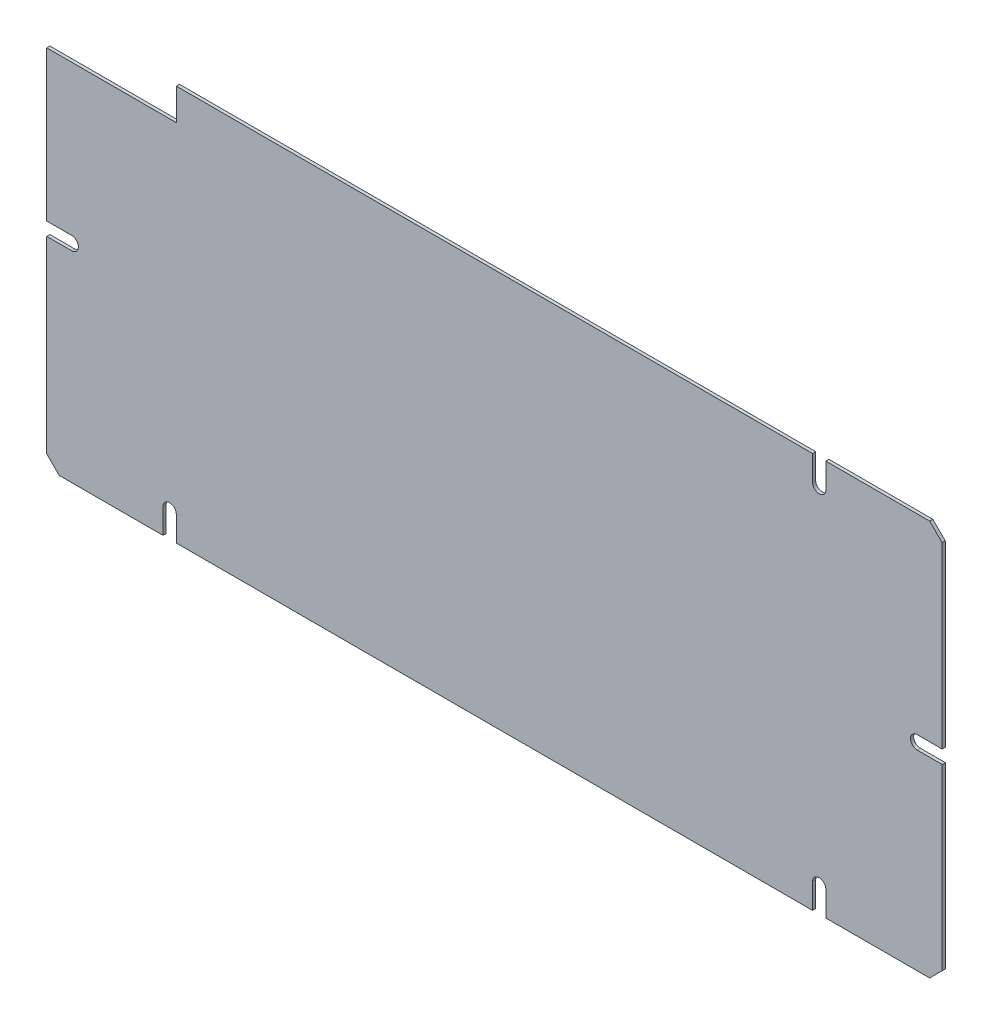
ISO-10303-21;
HEADER;
FILE_DESCRIPTION(('STEP AP214'),'2;1');
FILE_NAME('part.step','',(''),(''),'','','');
FILE_SCHEMA(('AUTOMOTIVE_DESIGN { 1 0 10303 214 1 1 1 1 }'));
ENDSEC;
DATA;
#1=APPLICATION_CONTEXT('core data for automotive mechanical design processes');
#2=APPLICATION_PROTOCOL_DEFINITION('international standard','automotive_design',2000,#1);
#3=PRODUCT_CONTEXT('',#1,'mechanical');
#4=PRODUCT('Part','Part','',(#3));
#5=PRODUCT_RELATED_PRODUCT_CATEGORY('part','',(#4));
#6=PRODUCT_DEFINITION_FORMATION('','',#4);
#7=PRODUCT_DEFINITION_CONTEXT('part definition',#1,'design');
#8=PRODUCT_DEFINITION('design','',#6,#7);
#9=PRODUCT_DEFINITION_SHAPE('','',#8);
#10=(LENGTH_UNIT() NAMED_UNIT(*) SI_UNIT(.MILLI.,.METRE.));
#11=(NAMED_UNIT(*) PLANE_ANGLE_UNIT() SI_UNIT($,.RADIAN.));
#12=(NAMED_UNIT(*) SI_UNIT($,.STERADIAN.) SOLID_ANGLE_UNIT());
#13=UNCERTAINTY_MEASURE_WITH_UNIT(LENGTH_MEASURE(1.E-05),#10,'distance_accuracy_value','');
#14=(GEOMETRIC_REPRESENTATION_CONTEXT(3) GLOBAL_UNCERTAINTY_ASSIGNED_CONTEXT((#13)) GLOBAL_UNIT_ASSIGNED_CONTEXT((#10,
#11,#12)) REPRESENTATION_CONTEXT('',''));
#15=CARTESIAN_POINT('',(0.,0.,0.));
#16=DIRECTION('',(0.,0.,1.));
#17=DIRECTION('',(1.,0.,0.));
#18=AXIS2_PLACEMENT_3D('',#15,#16,#17);
#19=CARTESIAN_POINT('',(227.584,100.584,1.5875));
#20=DIRECTION('',(-1.,0.,0.));
#21=DIRECTION('',(0.,0.,1.));
#22=AXIS2_PLACEMENT_3D('',#19,#20,#21);
#23=PLANE('',#22);
#24=DIRECTION('',(0.,1.,0.));
#25=VECTOR('',#24,1.);
#26=CARTESIAN_POINT('',(227.584,100.584,0.));
#27=LINE('',#26,#25);
#28=CARTESIAN_POINT('',(227.584,3.37819999999997,0.));
#29=VERTEX_POINT('',#28);
#30=CARTESIAN_POINT('',(227.584,94.2340000000001,0.));
#31=VERTEX_POINT('',#30);
#32=EDGE_CURVE('E389',#29,#31,#27,.T.);
#33=ORIENTED_EDGE('',*,*,#32,.T.);
#34=DIRECTION('',(0.,0.,1.));
#35=VECTOR('',#34,1.);
#36=CARTESIAN_POINT('',(227.584,94.2340000000001,1.5875));
#37=LINE('',#36,#35);
#38=CARTESIAN_POINT('',(227.584,94.2340000000001,1.5875));
#39=VERTEX_POINT('',#38);
#40=EDGE_CURVE('E11',#31,#39,#37,.T.);
#41=ORIENTED_EDGE('',*,*,#40,.T.);
#42=DIRECTION('',(0.,1.,0.));
#43=VECTOR('',#42,1.);
#44=CARTESIAN_POINT('',(227.584,100.584,1.5875));
#45=LINE('',#44,#43);
#46=CARTESIAN_POINT('',(227.584,3.37819999999997,1.5875));
#47=VERTEX_POINT('',#46);
#48=EDGE_CURVE('E392',#47,#39,#45,.T.);
#49=ORIENTED_EDGE('',*,*,#48,.F.);
#50=DIRECTION('',(0.,0.,1.));
#51=VECTOR('',#50,1.);
#52=CARTESIAN_POINT('',(227.584,3.37819999999997,-0.000999999999999916));
#53=LINE('',#52,#51);
#54=EDGE_CURVE('E258',#29,#47,#53,.T.);
#55=ORIENTED_EDGE('',*,*,#54,.F.);
#56=EDGE_LOOP('',(#33,#41,#49,#55));
#57=FACE_BOUND('',#56,.T.);
#58=ADVANCED_FACE('F34',(#57),#23,.F.);
#59=CARTESIAN_POINT('',(-227.584,100.584,1.5875));
#60=DIRECTION('',(1.,0.,0.));
#61=DIRECTION('',(0.,0.,-1.));
#62=AXIS2_PLACEMENT_3D('',#59,#60,#61);
#63=PLANE('',#62);
#64=DIRECTION('',(0.,-1.,0.));
#65=VECTOR('',#64,1.);
#66=CARTESIAN_POINT('',(-227.584,100.584,0.));
#67=LINE('',#66,#65);
#68=CARTESIAN_POINT('',(-227.584,1.50579999999863,0.));
#69=VERTEX_POINT('',#68);
#70=CARTESIAN_POINT('',(-227.584,-94.234,0.));
#71=VERTEX_POINT('',#70);
#72=EDGE_CURVE('E408',#69,#71,#67,.T.);
#73=ORIENTED_EDGE('',*,*,#72,.T.);
#74=DIRECTION('',(0.,0.,1.));
#75=VECTOR('',#74,1.);
#76=CARTESIAN_POINT('',(-227.584,-94.234,1.5875));
#77=LINE('',#76,#75);
#78=CARTESIAN_POINT('',(-227.584,-94.234,1.5875));
#79=VERTEX_POINT('',#78);
#80=EDGE_CURVE('E423',#71,#79,#77,.T.);
#81=ORIENTED_EDGE('',*,*,#80,.T.);
#82=DIRECTION('',(0.,-1.,0.));
#83=VECTOR('',#82,1.);
#84=CARTESIAN_POINT('',(-227.584,100.584,1.5875));
#85=LINE('',#84,#83);
#86=CARTESIAN_POINT('',(-227.584,1.50579999999863,1.5875));
#87=VERTEX_POINT('',#86);
#88=EDGE_CURVE('E395',#87,#79,#85,.T.);
#89=ORIENTED_EDGE('',*,*,#88,.F.);
#90=DIRECTION('',(0.,0.,1.));
#91=VECTOR('',#90,1.);
#92=CARTESIAN_POINT('',(-227.584,1.50579999999863,-0.000999999999999916));
#93=LINE('',#92,#91);
#94=EDGE_CURVE('E269',#69,#87,#93,.T.);
#95=ORIENTED_EDGE('',*,*,#94,.F.);
#96=EDGE_LOOP('',(#73,#81,#89,#95));
#97=FACE_BOUND('',#96,.T.);
#98=ADVANCED_FACE('F484',(#97),#63,.F.);
#99=CARTESIAN_POINT('',(-214.884,4.88399999999863,1.5875));
#100=DIRECTION('',(0.,0.,1.));
#101=DIRECTION('',(1.,0.,0.));
#102=AXIS2_PLACEMENT_3D('',#99,#100,#101);
#103=CYLINDRICAL_SURFACE('',#102,3.3782);
#104=DIRECTION('',(0.,0.,1.));
#105=VECTOR('',#104,1.);
#106=CARTESIAN_POINT('',(-214.884,1.50579999999863,1.5875));
#107=LINE('',#106,#105);
#108=CARTESIAN_POINT('',(-214.884,1.50579999999863,0.));
#109=VERTEX_POINT('',#108);
#110=CARTESIAN_POINT('',(-214.884,1.50579999999863,1.5875));
#111=VERTEX_POINT('',#110);
#112=EDGE_CURVE('E257',#109,#111,#107,.T.);
#113=ORIENTED_EDGE('',*,*,#112,.T.);
#114=CARTESIAN_POINT('',(-214.884,4.88399999999863,1.5875));
#115=DIRECTION('',(0.,0.,1.));
#116=DIRECTION('',(1.,0.,0.));
#117=AXIS2_PLACEMENT_3D('',#114,#115,#116);
#118=CIRCLE('',#117,3.3782);
#119=CARTESIAN_POINT('',(-214.884,8.26219999999862,1.5875));
#120=VERTEX_POINT('',#119);
#121=EDGE_CURVE('E383',#111,#120,#118,.T.);
#122=ORIENTED_EDGE('',*,*,#121,.T.);
#123=DIRECTION('',(0.,0.,1.));
#124=VECTOR('',#123,1.);
#125=CARTESIAN_POINT('',(-214.884,8.26219999999862,1.5875));
#126=LINE('',#125,#124);
#127=CARTESIAN_POINT('',(-214.884,8.26219999999862,0.));
#128=VERTEX_POINT('',#127);
#129=EDGE_CURVE('E255',#128,#120,#126,.T.);
#130=ORIENTED_EDGE('',*,*,#129,.F.);
#131=CARTESIAN_POINT('',(-214.884,4.88399999999863,0.));
#132=DIRECTION('',(0.,0.,1.));
#133=DIRECTION('',(1.,0.,0.));
#134=AXIS2_PLACEMENT_3D('',#131,#132,#133);
#135=CIRCLE('',#134,3.3782);
#136=EDGE_CURVE('E386',#109,#128,#135,.T.);
#137=ORIENTED_EDGE('',*,*,#136,.F.);
#138=EDGE_LOOP('',(#113,#122,#130,#137));
#139=FACE_BOUND('',#138,.T.);
#140=ADVANCED_FACE('F474',(#139),#103,.F.);
#141=CARTESIAN_POINT('',(214.884,0.,1.5875));
#142=DIRECTION('',(0.,0.,1.));
#143=DIRECTION('',(1.,0.,0.));
#144=AXIS2_PLACEMENT_3D('',#141,#142,#143);
#145=CYLINDRICAL_SURFACE('',#144,3.3782);
#146=DIRECTION('',(0.,0.,1.));
#147=VECTOR('',#146,1.);
#148=CARTESIAN_POINT('',(214.884,3.37820000000003,1.5875));
#149=LINE('',#148,#147);
#150=CARTESIAN_POINT('',(214.884,3.37820000000003,1.5875));
#151=VERTEX_POINT('',#150);
#152=CARTESIAN_POINT('',(214.884,3.37820000000003,0.));
#153=VERTEX_POINT('',#152);
#154=EDGE_CURVE('E253',#151,#153,#149,.F.);
#155=ORIENTED_EDGE('',*,*,#154,.F.);
#156=CARTESIAN_POINT('',(214.884,0.,1.5875));
#157=DIRECTION('',(0.,0.,1.));
#158=DIRECTION('',(1.,0.,0.));
#159=AXIS2_PLACEMENT_3D('',#156,#157,#158);
#160=CIRCLE('',#159,3.3782);
#161=CARTESIAN_POINT('',(214.884,-3.37819999999997,1.5875));
#162=VERTEX_POINT('',#161);
#163=EDGE_CURVE('E365',#151,#162,#160,.T.);
#164=ORIENTED_EDGE('',*,*,#163,.T.);
#165=DIRECTION('',(0.,0.,1.));
#166=VECTOR('',#165,1.);
#167=CARTESIAN_POINT('',(214.884,-3.37819999999997,1.5875));
#168=LINE('',#167,#166);
#169=CARTESIAN_POINT('',(214.884,-3.37819999999997,0.));
#170=VERTEX_POINT('',#169);
#171=EDGE_CURVE('E277',#170,#162,#168,.T.);
#172=ORIENTED_EDGE('',*,*,#171,.F.);
#173=CARTESIAN_POINT('',(214.884,0.,0.));
#174=DIRECTION('',(0.,0.,1.));
#175=DIRECTION('',(1.,0.,0.));
#176=AXIS2_PLACEMENT_3D('',#173,#174,#175);
#177=CIRCLE('',#176,3.3782);
#178=EDGE_CURVE('E368',#153,#170,#177,.T.);
#179=ORIENTED_EDGE('',*,*,#178,.F.);
#180=EDGE_LOOP('',(#155,#164,#172,#179));
#181=FACE_BOUND('',#180,.T.);
#182=ADVANCED_FACE('F533',(#181),#145,.F.);
#183=CARTESIAN_POINT('',(-227.584,-100.584,1.5875));
#184=DIRECTION('',(0.,1.,0.));
#185=DIRECTION('',(0.,0.,1.));
#186=AXIS2_PLACEMENT_3D('',#183,#184,#185);
#187=PLANE('',#186);
#188=DIRECTION('',(1.,0.,0.));
#189=VECTOR('',#188,1.);
#190=CARTESIAN_POINT('',(-227.584,-100.584,1.5875));
#191=LINE('',#190,#189);
#192=CARTESIAN_POINT('',(-221.234,-100.584,1.5875));
#193=VERTEX_POINT('',#192);
#194=CARTESIAN_POINT('',(-168.4782,-100.584,1.5875));
#195=VERTEX_POINT('',#194);
#196=EDGE_CURVE('E399',#193,#195,#191,.T.);
#197=ORIENTED_EDGE('',*,*,#196,.F.);
#198=DIRECTION('',(0.,0.,-1.));
#199=VECTOR('',#198,1.);
#200=CARTESIAN_POINT('',(-221.234,-100.584,1.5875));
#201=LINE('',#200,#199);
#202=CARTESIAN_POINT('',(-221.234,-100.584,0.));
#203=VERTEX_POINT('',#202);
#204=EDGE_CURVE('E401',#193,#203,#201,.T.);
#205=ORIENTED_EDGE('',*,*,#204,.T.);
#206=DIRECTION('',(1.,0.,0.));
#207=VECTOR('',#206,1.);
#208=CARTESIAN_POINT('',(-227.584,-100.584,0.));
#209=LINE('',#208,#207);
#210=CARTESIAN_POINT('',(-168.4782,-100.584,0.));
#211=VERTEX_POINT('',#210);
#212=EDGE_CURVE('E412',#203,#211,#209,.T.);
#213=ORIENTED_EDGE('',*,*,#212,.T.);
#214=DIRECTION('',(0.,0.,1.));
#215=VECTOR('',#214,1.);
#216=CARTESIAN_POINT('',(-168.4782,-100.584,-0.000999999999999916));
#217=LINE('',#216,#215);
#218=EDGE_CURVE('E302',#211,#195,#217,.T.);
#219=ORIENTED_EDGE('',*,*,#218,.T.);
#220=EDGE_LOOP('',(#197,#205,#213,#219));
#221=FACE_BOUND('',#220,.T.);
#222=ADVANCED_FACE('F492',(#221),#187,.F.);
#223=DIRECTION('',(0.,0.,-1.));
#224=VECTOR('',#223,1.);
#225=CARTESIAN_POINT('',(-161.7218,-100.584,-0.000999999999999916));
#226=LINE('',#225,#224);
#227=CARTESIAN_POINT('',(-161.7218,-100.584,1.5875));
#228=VERTEX_POINT('',#227);
#229=CARTESIAN_POINT('',(-161.7218,-100.584,0.));
#230=VERTEX_POINT('',#229);
#231=EDGE_CURVE('E299',#228,#230,#226,.T.);
#232=ORIENTED_EDGE('',*,*,#231,.T.);
#233=CARTESIAN_POINT('',(161.7218,-100.584,0.));
#234=VERTEX_POINT('',#233);
#235=EDGE_CURVE('E414',#230,#234,#209,.T.);
#236=ORIENTED_EDGE('',*,*,#235,.T.);
#237=DIRECTION('',(0.,0.,1.));
#238=VECTOR('',#237,1.);
#239=CARTESIAN_POINT('',(161.7218,-100.584,-0.000999999999999916));
#240=LINE('',#239,#238);
#241=CARTESIAN_POINT('',(161.7218,-100.584,1.5875));
#242=VERTEX_POINT('',#241);
#243=EDGE_CURVE('E326',#234,#242,#240,.T.);
#244=ORIENTED_EDGE('',*,*,#243,.T.);
#245=EDGE_CURVE('E402',#228,#242,#191,.T.);
#246=ORIENTED_EDGE('',*,*,#245,.F.);
#247=EDGE_LOOP('',(#232,#236,#244,#246));
#248=FACE_BOUND('',#247,.T.);
#249=ADVANCED_FACE('F505',(#248),#187,.F.);
#250=CARTESIAN_POINT('',(168.4782,-100.584,0.));
#251=VERTEX_POINT('',#250);
#252=CARTESIAN_POINT('',(221.234,-100.584,0.));
#253=VERTEX_POINT('',#252);
#254=EDGE_CURVE('E411',#251,#253,#209,.T.);
#255=ORIENTED_EDGE('',*,*,#254,.T.);
#256=DIRECTION('',(0.,0.,1.));
#257=VECTOR('',#256,1.);
#258=CARTESIAN_POINT('',(221.234,-100.584,1.5875));
#259=LINE('',#258,#257);
#260=CARTESIAN_POINT('',(221.234,-100.584,1.5875));
#261=VERTEX_POINT('',#260);
#262=EDGE_CURVE('E433',#253,#261,#259,.T.);
#263=ORIENTED_EDGE('',*,*,#262,.T.);
#264=CARTESIAN_POINT('',(168.4782,-100.584,1.5875));
#265=VERTEX_POINT('',#264);
#266=EDGE_CURVE('E398',#265,#261,#191,.T.);
#267=ORIENTED_EDGE('',*,*,#266,.F.);
#268=DIRECTION('',(0.,0.,-1.));
#269=VECTOR('',#268,1.);
#270=CARTESIAN_POINT('',(168.4782,-100.584,-0.000999999999999916));
#271=LINE('',#270,#269);
#272=EDGE_CURVE('E323',#265,#251,#271,.T.);
#273=ORIENTED_EDGE('',*,*,#272,.T.);
#274=EDGE_LOOP('',(#255,#263,#267,#273));
#275=FACE_BOUND('',#274,.T.);
#276=ADVANCED_FACE('F582',(#275),#187,.F.);
#277=CARTESIAN_POINT('',(0.,0.,1.5875));
#278=DIRECTION('',(0.,0.,1.));
#279=DIRECTION('',(1.,0.,0.));
#280=AXIS2_PLACEMENT_3D('',#277,#278,#279);
#281=PLANE('',#280);
#282=ORIENTED_EDGE('',*,*,#88,.T.);
#283=DIRECTION('',(-0.707106781186548,0.707106781186548,0.));
#284=VECTOR('',#283,1.);
#285=CARTESIAN_POINT('',(-160.909,-160.909,1.5875));
#286=LINE('',#285,#284);
#287=EDGE_CURVE('E428',#79,#193,#286,.F.);
#288=ORIENTED_EDGE('',*,*,#287,.T.);
#289=ORIENTED_EDGE('',*,*,#196,.T.);
#290=DIRECTION('',(0.,1.,0.));
#291=VECTOR('',#290,1.);
#292=CARTESIAN_POINT('',(-168.4782,-87.884,1.5875));
#293=LINE('',#292,#291);
#294=CARTESIAN_POINT('',(-168.4782,-87.884,1.5875));
#295=VERTEX_POINT('',#294);
#296=EDGE_CURVE('E308',#195,#295,#293,.T.);
#297=ORIENTED_EDGE('',*,*,#296,.T.);
#298=CARTESIAN_POINT('',(-165.1,-87.884,1.5875));
#299=DIRECTION('',(0.,0.,1.));
#300=DIRECTION('',(1.,0.,0.));
#301=AXIS2_PLACEMENT_3D('',#298,#299,#300);
#302=CIRCLE('',#301,3.3782);
#303=CARTESIAN_POINT('',(-161.7218,-87.884,1.5875));
#304=VERTEX_POINT('',#303);
#305=EDGE_CURVE('E371',#304,#295,#302,.T.);
#306=ORIENTED_EDGE('',*,*,#305,.F.);
#307=DIRECTION('',(0.,-1.,0.));
#308=VECTOR('',#307,1.);
#309=CARTESIAN_POINT('',(-161.7218,-87.884,1.5875));
#310=LINE('',#309,#308);
#311=EDGE_CURVE('E311',#304,#228,#310,.T.);
#312=ORIENTED_EDGE('',*,*,#311,.T.);
#313=ORIENTED_EDGE('',*,*,#245,.T.);
#314=DIRECTION('',(0.,1.,0.));
#315=VECTOR('',#314,1.);
#316=CARTESIAN_POINT('',(161.7218,-87.884,1.5875));
#317=LINE('',#316,#315);
#318=CARTESIAN_POINT('',(161.7218,-87.884,1.5875));
#319=VERTEX_POINT('',#318);
#320=EDGE_CURVE('E332',#242,#319,#317,.T.);
#321=ORIENTED_EDGE('',*,*,#320,.T.);
#322=CARTESIAN_POINT('',(165.1,-87.884,1.5875));
#323=DIRECTION('',(0.,0.,1.));
#324=DIRECTION('',(1.,0.,0.));
#325=AXIS2_PLACEMENT_3D('',#322,#323,#324);
#326=CIRCLE('',#325,3.3782);
#327=CARTESIAN_POINT('',(168.4782,-87.884,1.5875));
#328=VERTEX_POINT('',#327);
#329=EDGE_CURVE('E377',#328,#319,#326,.T.);
#330=ORIENTED_EDGE('',*,*,#329,.F.);
#331=DIRECTION('',(0.,-1.,0.));
#332=VECTOR('',#331,1.);
#333=CARTESIAN_POINT('',(168.4782,-87.884,1.5875));
#334=LINE('',#333,#332);
#335=EDGE_CURVE('E335',#328,#265,#334,.T.);
#336=ORIENTED_EDGE('',*,*,#335,.T.);
#337=ORIENTED_EDGE('',*,*,#266,.T.);
#338=DIRECTION('',(-0.707106781186548,-0.707106781186548,0.));
#339=VECTOR('',#338,1.);
#340=CARTESIAN_POINT('',(160.909,-160.909,1.5875));
#341=LINE('',#340,#339);
#342=CARTESIAN_POINT('',(227.584,-94.2340000000001,1.5875));
#343=VERTEX_POINT('',#342);
#344=EDGE_CURVE('E426',#261,#343,#341,.F.);
#345=ORIENTED_EDGE('',*,*,#344,.T.);
#346=CARTESIAN_POINT('',(227.584,-3.37819999999997,1.5875));
#347=VERTEX_POINT('',#346);
#348=EDGE_CURVE('E390',#343,#347,#45,.T.);
#349=ORIENTED_EDGE('',*,*,#348,.T.);
#350=DIRECTION('',(1.,0.,0.));
#351=VECTOR('',#350,1.);
#352=CARTESIAN_POINT('',(214.884,-3.37819999999997,1.5875));
#353=LINE('',#352,#351);
#354=EDGE_CURVE('E285',#162,#347,#353,.T.);
#355=ORIENTED_EDGE('',*,*,#354,.F.);
#356=ORIENTED_EDGE('',*,*,#163,.F.);
#357=DIRECTION('',(-1.,0.,0.));
#358=VECTOR('',#357,1.);
#359=CARTESIAN_POINT('',(227.584,3.37819999999997,1.5875));
#360=LINE('',#359,#358);
#361=EDGE_CURVE('E283',#47,#151,#360,.T.);
#362=ORIENTED_EDGE('',*,*,#361,.F.);
#363=ORIENTED_EDGE('',*,*,#48,.T.);
#364=DIRECTION('',(0.707106781186548,-0.707106781186548,0.));
#365=VECTOR('',#364,1.);
#366=CARTESIAN_POINT('',(160.909,160.909,1.5875));
#367=LINE('',#366,#365);
#368=CARTESIAN_POINT('',(221.234,100.584,1.5875));
#369=VERTEX_POINT('',#368);
#370=EDGE_CURVE('E49',#39,#369,#367,.F.);
#371=ORIENTED_EDGE('',*,*,#370,.T.);
#372=DIRECTION('',(-1.,0.,0.));
#373=VECTOR('',#372,1.);
#374=CARTESIAN_POINT('',(-227.584,100.584,1.5875));
#375=LINE('',#374,#373);
#376=CARTESIAN_POINT('',(168.4782,100.584,1.5875));
#377=VERTEX_POINT('',#376);
#378=EDGE_CURVE('E393',#369,#377,#375,.T.);
#379=ORIENTED_EDGE('',*,*,#378,.T.);
#380=DIRECTION('',(0.,1.,0.));
#381=VECTOR('',#380,1.);
#382=CARTESIAN_POINT('',(168.4782,87.884,1.5875));
#383=LINE('',#382,#381);
#384=CARTESIAN_POINT('',(168.4782,87.884,1.5875));
#385=VERTEX_POINT('',#384);
#386=EDGE_CURVE('E342',#385,#377,#383,.T.);
#387=ORIENTED_EDGE('',*,*,#386,.F.);
#388=CARTESIAN_POINT('',(165.1,87.884,1.5875));
#389=DIRECTION('',(0.,0.,1.));
#390=DIRECTION('',(1.,0.,0.));
#391=AXIS2_PLACEMENT_3D('',#388,#389,#390);
#392=CIRCLE('',#391,3.3782);
#393=CARTESIAN_POINT('',(161.7218,87.884,1.5875));
#394=VERTEX_POINT('',#393);
#395=EDGE_CURVE('E235',#394,#385,#392,.T.);
#396=ORIENTED_EDGE('',*,*,#395,.F.);
#397=DIRECTION('',(0.,-1.,0.));
#398=VECTOR('',#397,1.);
#399=CARTESIAN_POINT('',(161.7218,87.884,1.5875));
#400=LINE('',#399,#398);
#401=CARTESIAN_POINT('',(161.7218,100.584,1.5875));
#402=VERTEX_POINT('',#401);
#403=EDGE_CURVE('E356',#402,#394,#400,.T.);
#404=ORIENTED_EDGE('',*,*,#403,.F.);
#405=CARTESIAN_POINT('',(-161.7218,100.584,1.5875));
#406=VERTEX_POINT('',#405);
#407=EDGE_CURVE('E232',#402,#406,#375,.T.);
#408=ORIENTED_EDGE('',*,*,#407,.T.);
#409=DIRECTION('',(0.,1.,0.));
#410=VECTOR('',#409,1.);
#411=CARTESIAN_POINT('',(-161.7218,87.884,1.5875));
#412=LINE('',#411,#410);
#413=CARTESIAN_POINT('',(-161.7218,84.5058,1.5875));
#414=VERTEX_POINT('',#413);
#415=EDGE_CURVE('E223',#414,#406,#412,.T.);
#416=ORIENTED_EDGE('',*,*,#415,.F.);
#417=DIRECTION('',(-1.,0.,0.));
#418=VECTOR('',#417,1.);
#419=CARTESIAN_POINT('',(-161.7218,84.5058,1.5875));
#420=LINE('',#419,#418);
#421=CARTESIAN_POINT('',(-227.584,84.5058,1.5875));
#422=VERTEX_POINT('',#421);
#423=EDGE_CURVE('E228',#414,#422,#420,.T.);
#424=ORIENTED_EDGE('',*,*,#423,.T.);
#425=CARTESIAN_POINT('',(-227.584,8.26219999999862,1.5875));
#426=VERTEX_POINT('',#425);
#427=EDGE_CURVE('E396',#422,#426,#85,.T.);
#428=ORIENTED_EDGE('',*,*,#427,.T.);
#429=DIRECTION('',(-1.,0.,0.));
#430=VECTOR('',#429,1.);
#431=CARTESIAN_POINT('',(-214.884,8.26219999999862,1.5875));
#432=LINE('',#431,#430);
#433=EDGE_CURVE('E263',#120,#426,#432,.T.);
#434=ORIENTED_EDGE('',*,*,#433,.F.);
#435=ORIENTED_EDGE('',*,*,#121,.F.);
#436=DIRECTION('',(1.,0.,0.));
#437=VECTOR('',#436,1.);
#438=CARTESIAN_POINT('',(-227.584,1.50579999999863,1.5875));
#439=LINE('',#438,#437);
#440=EDGE_CURVE('E266',#87,#111,#439,.T.);
#441=ORIENTED_EDGE('',*,*,#440,.F.);
#442=EDGE_LOOP('',(#282,#288,#289,#297,#306,#312,#313,#321,#330,#336,#337,#345,#349,#355,#356,
#362,#363,#371,#379,#387,#396,#404,#408,#416,#424,#428,#434,#435,#441));
#443=FACE_BOUND('',#442,.T.);
#444=ADVANCED_FACE('F226',(#443),#281,.T.);
#445=CARTESIAN_POINT('',(0.,0.,0.));
#446=DIRECTION('',(0.,0.,1.));
#447=DIRECTION('',(1.,0.,0.));
#448=AXIS2_PLACEMENT_3D('',#445,#446,#447);
#449=PLANE('',#448);
#450=ORIENTED_EDGE('',*,*,#212,.F.);
#451=DIRECTION('',(0.707106781186548,-0.707106781186548,0.));
#452=VECTOR('',#451,1.);
#453=CARTESIAN_POINT('',(-221.234,-100.584,0.));
#454=LINE('',#453,#452);
#455=EDGE_CURVE('E421',#203,#71,#454,.F.);
#456=ORIENTED_EDGE('',*,*,#455,.T.);
#457=ORIENTED_EDGE('',*,*,#72,.F.);
#458=DIRECTION('',(-1.,0.,0.));
#459=VECTOR('',#458,1.);
#460=CARTESIAN_POINT('',(-227.584,1.50579999999863,0.));
#461=LINE('',#460,#459);
#462=EDGE_CURVE('E261',#109,#69,#461,.T.);
#463=ORIENTED_EDGE('',*,*,#462,.F.);
#464=ORIENTED_EDGE('',*,*,#136,.T.);
#465=DIRECTION('',(1.,0.,0.));
#466=VECTOR('',#465,1.);
#467=CARTESIAN_POINT('',(-214.884,8.26219999999862,0.));
#468=LINE('',#467,#466);
#469=CARTESIAN_POINT('',(-227.584,8.26219999999862,0.));
#470=VERTEX_POINT('',#469);
#471=EDGE_CURVE('E271',#470,#128,#468,.T.);
#472=ORIENTED_EDGE('',*,*,#471,.F.);
#473=CARTESIAN_POINT('',(-227.584,84.5058,0.));
#474=VERTEX_POINT('',#473);
#475=EDGE_CURVE('E409',#474,#470,#67,.T.);
#476=ORIENTED_EDGE('',*,*,#475,.F.);
#477=DIRECTION('',(-1.,0.,0.));
#478=VECTOR('',#477,1.);
#479=CARTESIAN_POINT('',(-161.7218,84.5058,0.));
#480=LINE('',#479,#478);
#481=CARTESIAN_POINT('',(-161.7218,84.5058,0.));
#482=VERTEX_POINT('',#481);
#483=EDGE_CURVE('E249',#482,#474,#480,.T.);
#484=ORIENTED_EDGE('',*,*,#483,.F.);
#485=DIRECTION('',(0.,-1.,0.));
#486=VECTOR('',#485,1.);
#487=CARTESIAN_POINT('',(-161.7218,87.884,0.));
#488=LINE('',#487,#486);
#489=CARTESIAN_POINT('',(-161.7218,100.584,0.));
#490=VERTEX_POINT('',#489);
#491=EDGE_CURVE('E236',#490,#482,#488,.T.);
#492=ORIENTED_EDGE('',*,*,#491,.F.);
#493=DIRECTION('',(-1.,0.,0.));
#494=VECTOR('',#493,1.);
#495=CARTESIAN_POINT('',(-227.584,100.584,0.));
#496=LINE('',#495,#494);
#497=CARTESIAN_POINT('',(161.7218,100.584,0.));
#498=VERTEX_POINT('',#497);
#499=EDGE_CURVE('E405',#498,#490,#496,.T.);
#500=ORIENTED_EDGE('',*,*,#499,.F.);
#501=DIRECTION('',(0.,1.,0.));
#502=VECTOR('',#501,1.);
#503=CARTESIAN_POINT('',(161.7218,87.884,0.));
#504=LINE('',#503,#502);
#505=CARTESIAN_POINT('',(161.7218,87.884,0.));
#506=VERTEX_POINT('',#505);
#507=EDGE_CURVE('E354',#506,#498,#504,.T.);
#508=ORIENTED_EDGE('',*,*,#507,.F.);
#509=CARTESIAN_POINT('',(165.1,87.884,0.));
#510=DIRECTION('',(0.,0.,1.));
#511=DIRECTION('',(1.,0.,0.));
#512=AXIS2_PLACEMENT_3D('',#509,#510,#511);
#513=CIRCLE('',#512,3.3782);
#514=CARTESIAN_POINT('',(168.4782,87.884,0.));
#515=VERTEX_POINT('',#514);
#516=EDGE_CURVE('E362',#506,#515,#513,.T.);
#517=ORIENTED_EDGE('',*,*,#516,.T.);
#518=DIRECTION('',(0.,-1.,0.));
#519=VECTOR('',#518,1.);
#520=CARTESIAN_POINT('',(168.4782,87.884,0.));
#521=LINE('',#520,#519);
#522=CARTESIAN_POINT('',(168.4782,100.584,0.));
#523=VERTEX_POINT('',#522);
#524=EDGE_CURVE('E352',#523,#515,#521,.T.);
#525=ORIENTED_EDGE('',*,*,#524,.F.);
#526=CARTESIAN_POINT('',(221.234,100.584,0.));
#527=VERTEX_POINT('',#526);
#528=EDGE_CURVE('E406',#527,#523,#496,.T.);
#529=ORIENTED_EDGE('',*,*,#528,.F.);
#530=DIRECTION('',(-0.707106781186548,0.707106781186548,0.));
#531=VECTOR('',#530,1.);
#532=CARTESIAN_POINT('',(221.234,100.584,0.));
#533=LINE('',#532,#531);
#534=EDGE_CURVE('E417',#527,#31,#533,.F.);
#535=ORIENTED_EDGE('',*,*,#534,.T.);
#536=ORIENTED_EDGE('',*,*,#32,.F.);
#537=DIRECTION('',(1.,0.,0.));
#538=VECTOR('',#537,1.);
#539=CARTESIAN_POINT('',(227.584,3.37819999999997,0.));
#540=LINE('',#539,#538);
#541=EDGE_CURVE('E281',#153,#29,#540,.T.);
#542=ORIENTED_EDGE('',*,*,#541,.F.);
#543=ORIENTED_EDGE('',*,*,#178,.T.);
#544=DIRECTION('',(-1.,0.,0.));
#545=VECTOR('',#544,1.);
#546=CARTESIAN_POINT('',(214.884,-3.37819999999997,0.));
#547=LINE('',#546,#545);
#548=CARTESIAN_POINT('',(227.584,-3.37819999999997,0.));
#549=VERTEX_POINT('',#548);
#550=EDGE_CURVE('E279',#549,#170,#547,.T.);
#551=ORIENTED_EDGE('',*,*,#550,.F.);
#552=CARTESIAN_POINT('',(227.584,-94.2340000000001,0.));
#553=VERTEX_POINT('',#552);
#554=EDGE_CURVE('E403',#553,#549,#27,.T.);
#555=ORIENTED_EDGE('',*,*,#554,.F.);
#556=DIRECTION('',(0.707106781186548,0.707106781186548,0.));
#557=VECTOR('',#556,1.);
#558=CARTESIAN_POINT('',(227.584,-94.2340000000001,0.));
#559=LINE('',#558,#557);
#560=EDGE_CURVE('E419',#553,#253,#559,.F.);
#561=ORIENTED_EDGE('',*,*,#560,.T.);
#562=ORIENTED_EDGE('',*,*,#254,.F.);
#563=DIRECTION('',(0.,1.,0.));
#564=VECTOR('',#563,1.);
#565=CARTESIAN_POINT('',(168.4782,-87.884,0.));
#566=LINE('',#565,#564);
#567=CARTESIAN_POINT('',(168.4782,-87.884,0.));
#568=VERTEX_POINT('',#567);
#569=EDGE_CURVE('E296',#251,#568,#566,.T.);
#570=ORIENTED_EDGE('',*,*,#569,.T.);
#571=CARTESIAN_POINT('',(165.1,-87.884,0.));
#572=DIRECTION('',(0.,0.,1.));
#573=DIRECTION('',(1.,0.,0.));
#574=AXIS2_PLACEMENT_3D('',#571,#572,#573);
#575=CIRCLE('',#574,3.3782);
#576=CARTESIAN_POINT('',(161.7218,-87.884,0.));
#577=VERTEX_POINT('',#576);
#578=EDGE_CURVE('E380',#568,#577,#575,.T.);
#579=ORIENTED_EDGE('',*,*,#578,.T.);
#580=DIRECTION('',(0.,-1.,0.));
#581=VECTOR('',#580,1.);
#582=CARTESIAN_POINT('',(161.7218,-87.884,0.));
#583=LINE('',#582,#581);
#584=EDGE_CURVE('E329',#577,#234,#583,.T.);
#585=ORIENTED_EDGE('',*,*,#584,.T.);
#586=ORIENTED_EDGE('',*,*,#235,.F.);
#587=DIRECTION('',(0.,1.,0.));
#588=VECTOR('',#587,1.);
#589=CARTESIAN_POINT('',(-161.7218,-87.884,0.));
#590=LINE('',#589,#588);
#591=CARTESIAN_POINT('',(-161.7218,-87.884,0.));
#592=VERTEX_POINT('',#591);
#593=EDGE_CURVE('E314',#230,#592,#590,.T.);
#594=ORIENTED_EDGE('',*,*,#593,.T.);
#595=CARTESIAN_POINT('',(-165.1,-87.884,0.));
#596=DIRECTION('',(0.,0.,1.));
#597=DIRECTION('',(1.,0.,0.));
#598=AXIS2_PLACEMENT_3D('',#595,#596,#597);
#599=CIRCLE('',#598,3.3782);
#600=CARTESIAN_POINT('',(-168.4782,-87.884,0.));
#601=VERTEX_POINT('',#600);
#602=EDGE_CURVE('E374',#592,#601,#599,.T.);
#603=ORIENTED_EDGE('',*,*,#602,.T.);
#604=DIRECTION('',(0.,-1.,0.));
#605=VECTOR('',#604,1.);
#606=CARTESIAN_POINT('',(-168.4782,-87.884,0.));
#607=LINE('',#606,#605);
#608=EDGE_CURVE('E305',#601,#211,#607,.T.);
#609=ORIENTED_EDGE('',*,*,#608,.T.);
#610=EDGE_LOOP('',(#450,#456,#457,#463,#464,#472,#476,#484,#492,#500,#508,#517,#525,#529,#535,
#536,#542,#543,#551,#555,#561,#562,#570,#579,#585,#586,#594,#603,#609));
#611=FACE_BOUND('',#610,.T.);
#612=ADVANCED_FACE('F444',(#611),#449,.F.);
#613=CARTESIAN_POINT('',(-227.584,100.584,1.5875));
#614=DIRECTION('',(0.,-1.,0.));
#615=DIRECTION('',(0.,0.,-1.));
#616=AXIS2_PLACEMENT_3D('',#613,#614,#615);
#617=PLANE('',#616);
#618=ORIENTED_EDGE('',*,*,#499,.T.);
#619=DIRECTION('',(0.,0.,-1.));
#620=VECTOR('',#619,1.);
#621=CARTESIAN_POINT('',(-161.7218,100.584,-0.000999999999999916));
#622=LINE('',#621,#620);
#623=EDGE_CURVE('E340',#406,#490,#622,.T.);
#624=ORIENTED_EDGE('',*,*,#623,.F.);
#625=ORIENTED_EDGE('',*,*,#407,.F.);
#626=DIRECTION('',(0.,0.,1.));
#627=VECTOR('',#626,1.);
#628=CARTESIAN_POINT('',(161.7218,100.584,-0.000999999999999916));
#629=LINE('',#628,#627);
#630=EDGE_CURVE('E350',#498,#402,#629,.T.);
#631=ORIENTED_EDGE('',*,*,#630,.F.);
#632=EDGE_LOOP('',(#618,#624,#625,#631));
#633=FACE_BOUND('',#632,.T.);
#634=ADVANCED_FACE('F460',(#633),#617,.F.);
#635=CARTESIAN_POINT('',(165.1,87.884,1.5875));
#636=DIRECTION('',(0.,0.,1.));
#637=DIRECTION('',(1.,0.,0.));
#638=AXIS2_PLACEMENT_3D('',#635,#636,#637);
#639=CYLINDRICAL_SURFACE('',#638,3.3782);
#640=DIRECTION('',(0.,0.,1.));
#641=VECTOR('',#640,1.);
#642=CARTESIAN_POINT('',(161.7218,87.884,1.5875));
#643=LINE('',#642,#641);
#644=EDGE_CURVE('E317',#394,#506,#643,.F.);
#645=ORIENTED_EDGE('',*,*,#644,.F.);
#646=ORIENTED_EDGE('',*,*,#395,.T.);
#647=DIRECTION('',(0.,0.,1.));
#648=VECTOR('',#647,1.);
#649=CARTESIAN_POINT('',(168.4782,87.884,1.5875));
#650=LINE('',#649,#648);
#651=EDGE_CURVE('E345',#515,#385,#650,.T.);
#652=ORIENTED_EDGE('',*,*,#651,.F.);
#653=ORIENTED_EDGE('',*,*,#516,.F.);
#654=EDGE_LOOP('',(#645,#646,#652,#653));
#655=FACE_BOUND('',#654,.T.);
#656=ADVANCED_FACE('F454',(#655),#639,.F.);
#657=ORIENTED_EDGE('',*,*,#348,.F.);
#658=DIRECTION('',(0.,0.,-1.));
#659=VECTOR('',#658,1.);
#660=CARTESIAN_POINT('',(227.584,-94.2340000000001,1.5875));
#661=LINE('',#660,#659);
#662=EDGE_CURVE('E430',#343,#553,#661,.T.);
#663=ORIENTED_EDGE('',*,*,#662,.T.);
#664=ORIENTED_EDGE('',*,*,#554,.T.);
#665=DIRECTION('',(0.,0.,1.));
#666=VECTOR('',#665,1.);
#667=CARTESIAN_POINT('',(227.584,-3.37819999999997,-0.000999999999999916));
#668=LINE('',#667,#666);
#669=EDGE_CURVE('E288',#549,#347,#668,.T.);
#670=ORIENTED_EDGE('',*,*,#669,.T.);
#671=EDGE_LOOP('',(#657,#663,#664,#670));
#672=FACE_BOUND('',#671,.T.);
#673=ADVANCED_FACE('F520',(#672),#23,.F.);
#674=ORIENTED_EDGE('',*,*,#378,.F.);
#675=DIRECTION('',(0.,0.,-1.));
#676=VECTOR('',#675,1.);
#677=CARTESIAN_POINT('',(221.234,100.584,1.5875));
#678=LINE('',#677,#676);
#679=EDGE_CURVE('E42',#369,#527,#678,.T.);
#680=ORIENTED_EDGE('',*,*,#679,.T.);
#681=ORIENTED_EDGE('',*,*,#528,.T.);
#682=DIRECTION('',(0.,0.,-1.));
#683=VECTOR('',#682,1.);
#684=CARTESIAN_POINT('',(168.4782,100.584,-0.000999999999999916));
#685=LINE('',#684,#683);
#686=EDGE_CURVE('E347',#377,#523,#685,.T.);
#687=ORIENTED_EDGE('',*,*,#686,.F.);
#688=EDGE_LOOP('',(#674,#680,#681,#687));
#689=FACE_BOUND('',#688,.T.);
#690=ADVANCED_FACE('F438',(#689),#617,.F.);
#691=ORIENTED_EDGE('',*,*,#427,.F.);
#692=DIRECTION('',(0.,0.,-1.));
#693=VECTOR('',#692,1.);
#694=CARTESIAN_POINT('',(-227.584,84.5058,1.5875));
#695=LINE('',#694,#693);
#696=EDGE_CURVE('E244',#422,#474,#695,.T.);
#697=ORIENTED_EDGE('',*,*,#696,.T.);
#698=ORIENTED_EDGE('',*,*,#475,.T.);
#699=DIRECTION('',(0.,0.,1.));
#700=VECTOR('',#699,1.);
#701=CARTESIAN_POINT('',(-227.584,8.26219999999862,-0.000999999999999916));
#702=LINE('',#701,#700);
#703=EDGE_CURVE('E268',#470,#426,#702,.T.);
#704=ORIENTED_EDGE('',*,*,#703,.T.);
#705=EDGE_LOOP('',(#691,#697,#698,#704));
#706=FACE_BOUND('',#705,.T.);
#707=ADVANCED_FACE('F465',(#706),#63,.F.);
#708=CARTESIAN_POINT('',(165.1,-87.884,1.5875));
#709=DIRECTION('',(0.,0.,1.));
#710=DIRECTION('',(1.,0.,0.));
#711=AXIS2_PLACEMENT_3D('',#708,#709,#710);
#712=CYLINDRICAL_SURFACE('',#711,3.3782);
#713=ORIENTED_EDGE('',*,*,#329,.T.);
#714=DIRECTION('',(0.,0.,1.));
#715=VECTOR('',#714,1.);
#716=CARTESIAN_POINT('',(161.7218,-87.884,1.5875));
#717=LINE('',#716,#715);
#718=EDGE_CURVE('E320',#319,#577,#717,.F.);
#719=ORIENTED_EDGE('',*,*,#718,.T.);
#720=ORIENTED_EDGE('',*,*,#578,.F.);
#721=DIRECTION('',(0.,0.,1.));
#722=VECTOR('',#721,1.);
#723=CARTESIAN_POINT('',(168.4782,-87.884,1.5875));
#724=LINE('',#723,#722);
#725=EDGE_CURVE('E275',#568,#328,#724,.T.);
#726=ORIENTED_EDGE('',*,*,#725,.T.);
#727=EDGE_LOOP('',(#713,#719,#720,#726));
#728=FACE_BOUND('',#727,.T.);
#729=ADVANCED_FACE('F574',(#728),#712,.F.);
#730=CARTESIAN_POINT('',(-165.1,-87.884,1.5875));
#731=DIRECTION('',(0.,0.,1.));
#732=DIRECTION('',(1.,0.,0.));
#733=AXIS2_PLACEMENT_3D('',#730,#731,#732);
#734=CYLINDRICAL_SURFACE('',#733,3.3782);
#735=ORIENTED_EDGE('',*,*,#305,.T.);
#736=DIRECTION('',(0.,0.,1.));
#737=VECTOR('',#736,1.);
#738=CARTESIAN_POINT('',(-168.4782,-87.884,1.5875));
#739=LINE('',#738,#737);
#740=EDGE_CURVE('E295',#295,#601,#739,.F.);
#741=ORIENTED_EDGE('',*,*,#740,.T.);
#742=ORIENTED_EDGE('',*,*,#602,.F.);
#743=DIRECTION('',(0.,0.,1.));
#744=VECTOR('',#743,1.);
#745=CARTESIAN_POINT('',(-161.7218,-87.884,1.5875));
#746=LINE('',#745,#744);
#747=EDGE_CURVE('E292',#592,#304,#746,.T.);
#748=ORIENTED_EDGE('',*,*,#747,.T.);
#749=EDGE_LOOP('',(#735,#741,#742,#748));
#750=FACE_BOUND('',#749,.T.);
#751=ADVANCED_FACE('F499',(#750),#734,.F.);
#752=CARTESIAN_POINT('',(-161.7218,87.884,-0.000999999999999916));
#753=DIRECTION('',(1.,0.,0.));
#754=DIRECTION('',(0.,0.,-1.));
#755=AXIS2_PLACEMENT_3D('',#752,#753,#754);
#756=PLANE('',#755);
#757=ORIENTED_EDGE('',*,*,#623,.T.);
#758=ORIENTED_EDGE('',*,*,#491,.T.);
#759=DIRECTION('',(0.,0.,-1.));
#760=VECTOR('',#759,1.);
#761=CARTESIAN_POINT('',(-161.7218,84.5058,1.5875));
#762=LINE('',#761,#760);
#763=EDGE_CURVE('E239',#414,#482,#762,.T.);
#764=ORIENTED_EDGE('',*,*,#763,.F.);
#765=ORIENTED_EDGE('',*,*,#415,.T.);
#766=EDGE_LOOP('',(#757,#758,#764,#765));
#767=FACE_BOUND('',#766,.T.);
#768=ADVANCED_FACE('F240',(#767),#756,.F.);
#769=CARTESIAN_POINT('',(168.4782,87.884,-0.000999999999999916));
#770=DIRECTION('',(1.,0.,0.));
#771=DIRECTION('',(0.,0.,-1.));
#772=AXIS2_PLACEMENT_3D('',#769,#770,#771);
#773=PLANE('',#772);
#774=ORIENTED_EDGE('',*,*,#686,.T.);
#775=ORIENTED_EDGE('',*,*,#524,.T.);
#776=ORIENTED_EDGE('',*,*,#651,.T.);
#777=ORIENTED_EDGE('',*,*,#386,.T.);
#778=EDGE_LOOP('',(#774,#775,#776,#777));
#779=FACE_BOUND('',#778,.T.);
#780=ADVANCED_FACE('F450',(#779),#773,.F.);
#781=CARTESIAN_POINT('',(161.7218,87.884,-0.000999999999999916));
#782=DIRECTION('',(-1.,0.,0.));
#783=DIRECTION('',(0.,0.,1.));
#784=AXIS2_PLACEMENT_3D('',#781,#782,#783);
#785=PLANE('',#784);
#786=ORIENTED_EDGE('',*,*,#630,.T.);
#787=ORIENTED_EDGE('',*,*,#403,.T.);
#788=ORIENTED_EDGE('',*,*,#644,.T.);
#789=ORIENTED_EDGE('',*,*,#507,.T.);
#790=EDGE_LOOP('',(#786,#787,#788,#789));
#791=FACE_BOUND('',#790,.T.);
#792=ADVANCED_FACE('F568',(#791),#785,.F.);
#793=CARTESIAN_POINT('',(-161.7218,-87.884,-0.000999999999999916));
#794=DIRECTION('',(-1.,0.,0.));
#795=DIRECTION('',(0.,0.,1.));
#796=AXIS2_PLACEMENT_3D('',#793,#794,#795);
#797=PLANE('',#796);
#798=ORIENTED_EDGE('',*,*,#311,.F.);
#799=ORIENTED_EDGE('',*,*,#747,.F.);
#800=ORIENTED_EDGE('',*,*,#593,.F.);
#801=ORIENTED_EDGE('',*,*,#231,.F.);
#802=EDGE_LOOP('',(#798,#799,#800,#801));
#803=FACE_BOUND('',#802,.T.);
#804=ADVANCED_FACE('F620',(#803),#797,.T.);
#805=CARTESIAN_POINT('',(-168.4782,-87.884,-0.000999999999999916));
#806=DIRECTION('',(1.,0.,0.));
#807=DIRECTION('',(0.,0.,-1.));
#808=AXIS2_PLACEMENT_3D('',#805,#806,#807);
#809=PLANE('',#808);
#810=ORIENTED_EDGE('',*,*,#608,.F.);
#811=ORIENTED_EDGE('',*,*,#740,.F.);
#812=ORIENTED_EDGE('',*,*,#296,.F.);
#813=ORIENTED_EDGE('',*,*,#218,.F.);
#814=EDGE_LOOP('',(#810,#811,#812,#813));
#815=FACE_BOUND('',#814,.T.);
#816=ADVANCED_FACE('F496',(#815),#809,.T.);
#817=CARTESIAN_POINT('',(168.4782,-87.884,-0.000999999999999916));
#818=DIRECTION('',(-1.,0.,0.));
#819=DIRECTION('',(0.,0.,1.));
#820=AXIS2_PLACEMENT_3D('',#817,#818,#819);
#821=PLANE('',#820);
#822=ORIENTED_EDGE('',*,*,#335,.F.);
#823=ORIENTED_EDGE('',*,*,#725,.F.);
#824=ORIENTED_EDGE('',*,*,#569,.F.);
#825=ORIENTED_EDGE('',*,*,#272,.F.);
#826=EDGE_LOOP('',(#822,#823,#824,#825));
#827=FACE_BOUND('',#826,.T.);
#828=ADVANCED_FACE('F630',(#827),#821,.T.);
#829=CARTESIAN_POINT('',(161.7218,-87.884,-0.000999999999999916));
#830=DIRECTION('',(1.,0.,0.));
#831=DIRECTION('',(0.,0.,-1.));
#832=AXIS2_PLACEMENT_3D('',#829,#830,#831);
#833=PLANE('',#832);
#834=ORIENTED_EDGE('',*,*,#584,.F.);
#835=ORIENTED_EDGE('',*,*,#718,.F.);
#836=ORIENTED_EDGE('',*,*,#320,.F.);
#837=ORIENTED_EDGE('',*,*,#243,.F.);
#838=EDGE_LOOP('',(#834,#835,#836,#837));
#839=FACE_BOUND('',#838,.T.);
#840=ADVANCED_FACE('F546',(#839),#833,.T.);
#841=CARTESIAN_POINT('',(214.884,-3.37819999999997,-0.000999999999999916));
#842=DIRECTION('',(0.,-1.,0.));
#843=DIRECTION('',(0.,0.,-1.));
#844=AXIS2_PLACEMENT_3D('',#841,#842,#843);
#845=PLANE('',#844);
#846=ORIENTED_EDGE('',*,*,#550,.T.);
#847=ORIENTED_EDGE('',*,*,#171,.T.);
#848=ORIENTED_EDGE('',*,*,#354,.T.);
#849=ORIENTED_EDGE('',*,*,#669,.F.);
#850=EDGE_LOOP('',(#846,#847,#848,#849));
#851=FACE_BOUND('',#850,.T.);
#852=ADVANCED_FACE('F529',(#851),#845,.F.);
#853=CARTESIAN_POINT('',(227.584,3.37819999999997,-0.000999999999999916));
#854=DIRECTION('',(0.,1.,0.));
#855=DIRECTION('',(-1.,0.,0.));
#856=AXIS2_PLACEMENT_3D('',#853,#854,#855);
#857=PLANE('',#856);
#858=ORIENTED_EDGE('',*,*,#541,.T.);
#859=ORIENTED_EDGE('',*,*,#54,.T.);
#860=ORIENTED_EDGE('',*,*,#361,.T.);
#861=ORIENTED_EDGE('',*,*,#154,.T.);
#862=EDGE_LOOP('',(#858,#859,#860,#861));
#863=FACE_BOUND('',#862,.T.);
#864=ADVANCED_FACE('F538',(#863),#857,.F.);
#865=CARTESIAN_POINT('',(-214.884,8.26219999999862,-0.000999999999999916));
#866=DIRECTION('',(0.,1.,0.));
#867=DIRECTION('',(-1.,0.,0.));
#868=AXIS2_PLACEMENT_3D('',#865,#866,#867);
#869=PLANE('',#868);
#870=ORIENTED_EDGE('',*,*,#471,.T.);
#871=ORIENTED_EDGE('',*,*,#129,.T.);
#872=ORIENTED_EDGE('',*,*,#433,.T.);
#873=ORIENTED_EDGE('',*,*,#703,.F.);
#874=EDGE_LOOP('',(#870,#871,#872,#873));
#875=FACE_BOUND('',#874,.T.);
#876=ADVANCED_FACE('F470',(#875),#869,.F.);
#877=CARTESIAN_POINT('',(-227.584,1.50579999999863,-0.000999999999999916));
#878=DIRECTION('',(0.,-1.,0.));
#879=DIRECTION('',(0.,0.,-1.));
#880=AXIS2_PLACEMENT_3D('',#877,#878,#879);
#881=PLANE('',#880);
#882=ORIENTED_EDGE('',*,*,#462,.T.);
#883=ORIENTED_EDGE('',*,*,#94,.T.);
#884=ORIENTED_EDGE('',*,*,#440,.T.);
#885=ORIENTED_EDGE('',*,*,#112,.F.);
#886=EDGE_LOOP('',(#882,#883,#884,#885));
#887=FACE_BOUND('',#886,.T.);
#888=ADVANCED_FACE('F480',(#887),#881,.F.);
#889=CARTESIAN_POINT('',(-161.7218,84.5058,1.5875));
#890=DIRECTION('',(0.,-1.,0.));
#891=DIRECTION('',(0.,0.,-1.));
#892=AXIS2_PLACEMENT_3D('',#889,#890,#891);
#893=PLANE('',#892);
#894=ORIENTED_EDGE('',*,*,#423,.F.);
#895=ORIENTED_EDGE('',*,*,#763,.T.);
#896=ORIENTED_EDGE('',*,*,#483,.T.);
#897=ORIENTED_EDGE('',*,*,#696,.F.);
#898=EDGE_LOOP('',(#894,#895,#896,#897));
#899=FACE_BOUND('',#898,.T.);
#900=ADVANCED_FACE('F246',(#899),#893,.F.);
#901=CARTESIAN_POINT('',(-221.234,-100.584,1.5875));
#902=DIRECTION('',(0.707106781186548,0.707106781186548,0.));
#903=DIRECTION('',(0.,0.,-1.));
#904=AXIS2_PLACEMENT_3D('',#901,#902,#903);
#905=PLANE('',#904);
#906=ORIENTED_EDGE('',*,*,#287,.F.);
#907=ORIENTED_EDGE('',*,*,#80,.F.);
#908=ORIENTED_EDGE('',*,*,#455,.F.);
#909=ORIENTED_EDGE('',*,*,#204,.F.);
#910=EDGE_LOOP('',(#906,#907,#908,#909));
#911=FACE_BOUND('',#910,.T.);
#912=ADVANCED_FACE('F490',(#911),#905,.F.);
#913=CARTESIAN_POINT('',(227.584,-94.2340000000001,1.5875));
#914=DIRECTION('',(-0.707106781186547,0.707106781186547,0.));
#915=DIRECTION('',(0.,0.,-1.));
#916=AXIS2_PLACEMENT_3D('',#913,#914,#915);
#917=PLANE('',#916);
#918=ORIENTED_EDGE('',*,*,#344,.F.);
#919=ORIENTED_EDGE('',*,*,#262,.F.);
#920=ORIENTED_EDGE('',*,*,#560,.F.);
#921=ORIENTED_EDGE('',*,*,#662,.F.);
#922=EDGE_LOOP('',(#918,#919,#920,#921));
#923=FACE_BOUND('',#922,.T.);
#924=ADVANCED_FACE('F517',(#923),#917,.F.);
#925=CARTESIAN_POINT('',(221.234,100.584,1.5875));
#926=DIRECTION('',(-0.707106781186548,-0.707106781186548,0.));
#927=DIRECTION('',(0.,0.,-1.));
#928=AXIS2_PLACEMENT_3D('',#925,#926,#927);
#929=PLANE('',#928);
#930=ORIENTED_EDGE('',*,*,#370,.F.);
#931=ORIENTED_EDGE('',*,*,#40,.F.);
#932=ORIENTED_EDGE('',*,*,#534,.F.);
#933=ORIENTED_EDGE('',*,*,#679,.F.);
#934=EDGE_LOOP('',(#930,#931,#932,#933));
#935=FACE_BOUND('',#934,.T.);
#936=ADVANCED_FACE('F36',(#935),#929,.F.);
#937=CLOSED_SHELL('',(#58,#98,#140,#182,#222,#249,#276,#444,#612,#634,#656,#673,#690,#707,#729,
#751,#768,#780,#792,#804,#816,#828,#840,#852,#864,#876,#888,#900,#912,#924,#936));
#938=MANIFOLD_SOLID_BREP('B2',#937);
#939=ADVANCED_BREP_SHAPE_REPRESENTATION('',(#18,#938),#14);
#940=SHAPE_DEFINITION_REPRESENTATION(#9,#939);
ENDSEC;
END-ISO-10303-21;
